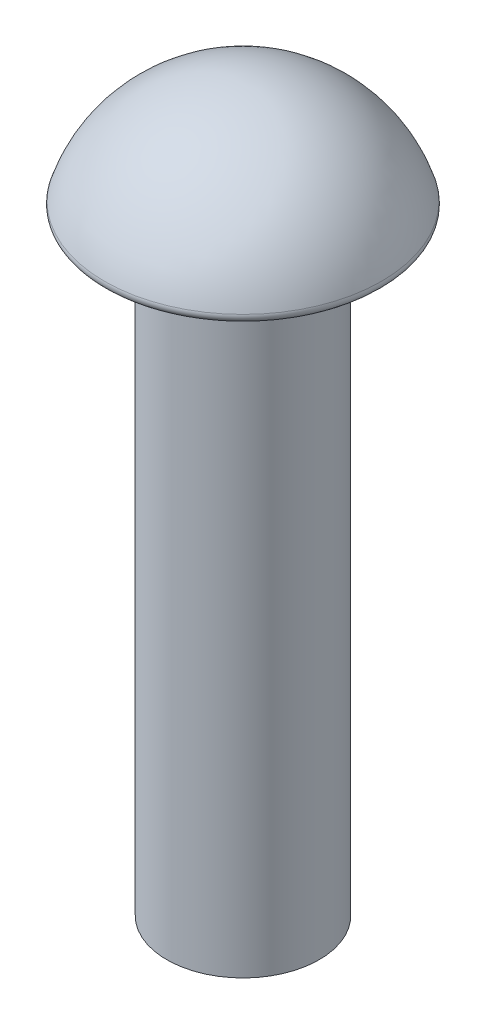
ISO-10303-21;
HEADER;
FILE_DESCRIPTION(('STEP AP214'),'2;1');
FILE_NAME('part.step','',(''),(''),'','','');
FILE_SCHEMA(('AUTOMOTIVE_DESIGN { 1 0 10303 214 1 1 1 1 }'));
ENDSEC;
DATA;
#1=APPLICATION_CONTEXT('core data for automotive mechanical design processes');
#2=APPLICATION_PROTOCOL_DEFINITION('international standard','automotive_design',2000,#1);
#3=PRODUCT_CONTEXT('',#1,'mechanical');
#4=PRODUCT('Part','Part','',(#3));
#5=PRODUCT_RELATED_PRODUCT_CATEGORY('part','',(#4));
#6=PRODUCT_DEFINITION_FORMATION('','',#4);
#7=PRODUCT_DEFINITION_CONTEXT('part definition',#1,'design');
#8=PRODUCT_DEFINITION('design','',#6,#7);
#9=PRODUCT_DEFINITION_SHAPE('','',#8);
#10=(LENGTH_UNIT() NAMED_UNIT(*) SI_UNIT(.MILLI.,.METRE.));
#11=(NAMED_UNIT(*) PLANE_ANGLE_UNIT() SI_UNIT($,.RADIAN.));
#12=(NAMED_UNIT(*) SI_UNIT($,.STERADIAN.) SOLID_ANGLE_UNIT());
#13=UNCERTAINTY_MEASURE_WITH_UNIT(LENGTH_MEASURE(1.E-05),#10,'distance_accuracy_value','');
#14=(GEOMETRIC_REPRESENTATION_CONTEXT(3) GLOBAL_UNCERTAINTY_ASSIGNED_CONTEXT((#13)) GLOBAL_UNIT_ASSIGNED_CONTEXT((#10,
#11,#12)) REPRESENTATION_CONTEXT('',''));
#15=CARTESIAN_POINT('',(0.,0.,0.));
#16=DIRECTION('',(0.,0.,1.));
#17=DIRECTION('',(1.,0.,0.));
#18=AXIS2_PLACEMENT_3D('',#15,#16,#17);
#19=CARTESIAN_POINT('',(0.,0.,0.));
#20=DIRECTION('',(0.,-1.,0.));
#21=DIRECTION('',(0.,0.,-1.));
#22=AXIS2_PLACEMENT_3D('',#19,#20,#21);
#23=PLANE('',#22);
#24=CARTESIAN_POINT('',(0.,0.,0.));
#25=DIRECTION('',(0.,-1.,0.));
#26=DIRECTION('',(0.,0.,-1.));
#27=AXIS2_PLACEMENT_3D('',#24,#25,#26);
#28=CIRCLE('',#27,1.375);
#29=CARTESIAN_POINT('',(0.,0.,-1.375));
#30=VERTEX_POINT('',#29);
#31=EDGE_CURVE('E44',#30,#30,#28,.T.);
#32=ORIENTED_EDGE('',*,*,#31,.T.);
#33=EDGE_LOOP('',(#32));
#34=FACE_BOUND('',#33,.T.);
#35=ADVANCED_FACE('F30',(#34),#23,.T.);
#36=CARTESIAN_POINT('',(0.,10.3806541107838,0.));
#37=DIRECTION('',(0.,-1.,0.));
#38=DIRECTION('',(0.,0.,-1.));
#39=AXIS2_PLACEMENT_3D('',#36,#37,#38);
#40=SPHERICAL_SURFACE('',#39,2.61934588921621);
#41=CARTESIAN_POINT('',(0.,11.1623016575425,0.));
#42=DIRECTION('',(0.,-1.,0.));
#43=DIRECTION('',(0.,0.,-1.));
#44=AXIS2_PLACEMENT_3D('',#41,#42,#43);
#45=CIRCLE('',#44,2.5);
#46=CARTESIAN_POINT('',(0.,11.1623016575425,-2.5));
#47=VERTEX_POINT('',#46);
#48=EDGE_CURVE('E10',#47,#47,#45,.T.);
#49=ORIENTED_EDGE('',*,*,#48,.F.);
#50=EDGE_LOOP('',(#49));
#51=FACE_BOUND('',#50,.T.);
#52=ADVANCED_FACE('F62',(#51),#40,.T.);
#53=CARTESIAN_POINT('',(0.,11.125,0.));
#54=DIRECTION('',(0.,-1.,0.));
#55=DIRECTION('',(0.,0.,-1.));
#56=AXIS2_PLACEMENT_3D('',#53,#54,#55);
#57=TOROIDAL_SURFACE('',#56,2.38069540518243,0.125);
#58=ORIENTED_EDGE('',*,*,#48,.T.);
#59=EDGE_LOOP('',(#58));
#60=FACE_BOUND('',#59,.T.);
#61=CARTESIAN_POINT('',(0.,11.,0.));
#62=DIRECTION('',(0.,-1.,0.));
#63=DIRECTION('',(0.,0.,-1.));
#64=AXIS2_PLACEMENT_3D('',#61,#62,#63);
#65=CIRCLE('',#64,2.38069540518243);
#66=CARTESIAN_POINT('',(0.,11.,-2.38069540518243));
#67=VERTEX_POINT('',#66);
#68=EDGE_CURVE('E36',#67,#67,#65,.T.);
#69=ORIENTED_EDGE('',*,*,#68,.F.);
#70=EDGE_LOOP('',(#69));
#71=FACE_BOUND('',#70,.T.);
#72=ADVANCED_FACE('F59',(#60,#71),#57,.T.);
#73=CARTESIAN_POINT('',(0.,11.,-1.375));
#74=DIRECTION('',(0.,-1.,0.));
#75=DIRECTION('',(0.,0.,-1.));
#76=AXIS2_PLACEMENT_3D('',#73,#74,#75);
#77=PLANE('',#76);
#78=ORIENTED_EDGE('',*,*,#68,.T.);
#79=EDGE_LOOP('',(#78));
#80=FACE_BOUND('',#79,.T.);
#81=CARTESIAN_POINT('',(0.,11.,0.));
#82=DIRECTION('',(0.,-1.,0.));
#83=DIRECTION('',(0.,0.,-1.));
#84=AXIS2_PLACEMENT_3D('',#81,#82,#83);
#85=CIRCLE('',#84,1.375);
#86=CARTESIAN_POINT('',(0.,11.,-1.375));
#87=VERTEX_POINT('',#86);
#88=EDGE_CURVE('E40',#87,#87,#85,.T.);
#89=ORIENTED_EDGE('',*,*,#88,.F.);
#90=EDGE_LOOP('',(#89));
#91=FACE_BOUND('',#90,.T.);
#92=ADVANCED_FACE('F53',(#80,#91),#77,.T.);
#93=CARTESIAN_POINT('',(0.,0.,0.));
#94=DIRECTION('',(0.,-1.,0.));
#95=DIRECTION('',(0.,0.,-1.));
#96=AXIS2_PLACEMENT_3D('',#93,#94,#95);
#97=CYLINDRICAL_SURFACE('',#96,1.375);
#98=ORIENTED_EDGE('',*,*,#88,.T.);
#99=EDGE_LOOP('',(#98));
#100=FACE_BOUND('',#99,.T.);
#101=ORIENTED_EDGE('',*,*,#31,.F.);
#102=EDGE_LOOP('',(#101));
#103=FACE_BOUND('',#102,.T.);
#104=ADVANCED_FACE('F51',(#100,#103),#97,.T.);
#105=CLOSED_SHELL('',(#35,#52,#72,#92,#104));
#106=MANIFOLD_SOLID_BREP('B2',#105);
#107=ADVANCED_BREP_SHAPE_REPRESENTATION('',(#18,#106),#14);
#108=SHAPE_DEFINITION_REPRESENTATION(#9,#107);
ENDSEC;
END-ISO-10303-21;
